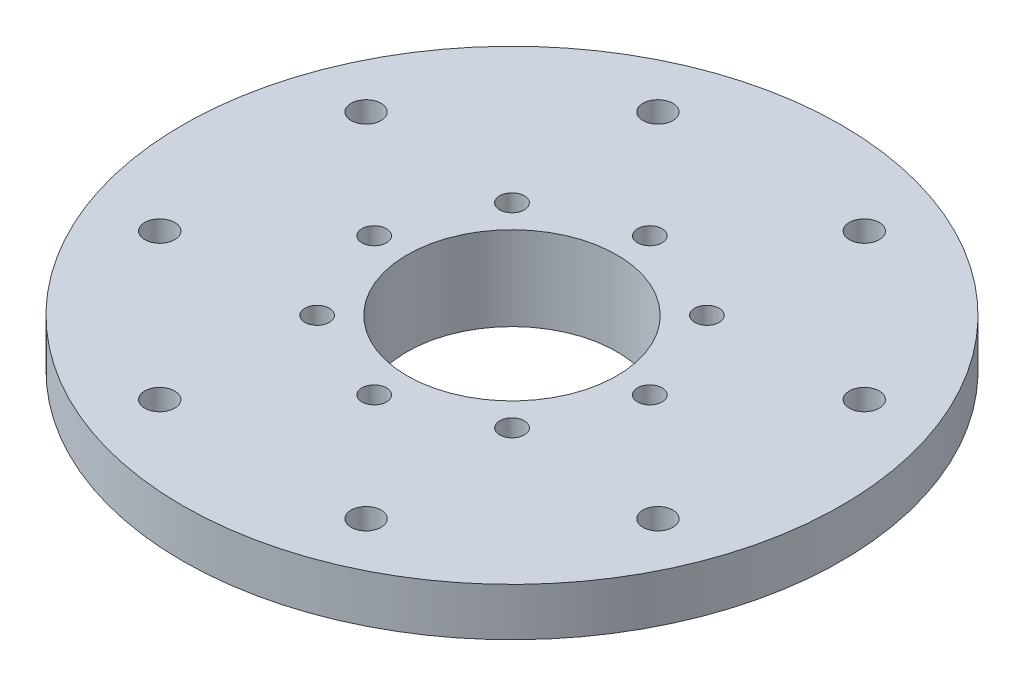
ISO-10303-21;
HEADER;
FILE_DESCRIPTION(('STEP AP214'),'2;1');
FILE_NAME('part.step','',(''),(''),'','','');
FILE_SCHEMA(('AUTOMOTIVE_DESIGN { 1 0 10303 214 1 1 1 1 }'));
ENDSEC;
DATA;
#1=APPLICATION_CONTEXT('core data for automotive mechanical design processes');
#2=APPLICATION_PROTOCOL_DEFINITION('international standard','automotive_design',2000,#1);
#3=PRODUCT_CONTEXT('',#1,'mechanical');
#4=PRODUCT('Part','Part','',(#3));
#5=PRODUCT_RELATED_PRODUCT_CATEGORY('part','',(#4));
#6=PRODUCT_DEFINITION_FORMATION('','',#4);
#7=PRODUCT_DEFINITION_CONTEXT('part definition',#1,'design');
#8=PRODUCT_DEFINITION('design','',#6,#7);
#9=PRODUCT_DEFINITION_SHAPE('','',#8);
#10=(LENGTH_UNIT() NAMED_UNIT(*) SI_UNIT(.MILLI.,.METRE.));
#11=(NAMED_UNIT(*) PLANE_ANGLE_UNIT() SI_UNIT($,.RADIAN.));
#12=(NAMED_UNIT(*) SI_UNIT($,.STERADIAN.) SOLID_ANGLE_UNIT());
#13=UNCERTAINTY_MEASURE_WITH_UNIT(LENGTH_MEASURE(1.E-05),#10,'distance_accuracy_value','');
#14=(GEOMETRIC_REPRESENTATION_CONTEXT(3) GLOBAL_UNCERTAINTY_ASSIGNED_CONTEXT((#13)) GLOBAL_UNIT_ASSIGNED_CONTEXT((#10,
#11,#12)) REPRESENTATION_CONTEXT('',''));
#15=CARTESIAN_POINT('',(0.,0.,0.));
#16=DIRECTION('',(0.,0.,1.));
#17=DIRECTION('',(1.,0.,0.));
#18=AXIS2_PLACEMENT_3D('',#15,#16,#17);
#19=CARTESIAN_POINT('',(0.,-6.,0.));
#20=DIRECTION('',(0.,-1.,0.));
#21=DIRECTION('',(0.,0.,-1.));
#22=AXIS2_PLACEMENT_3D('',#19,#20,#21);
#23=PLANE('',#22);
#24=CARTESIAN_POINT('',(-23.,-6.,-2.40912212380176E-13));
#25=DIRECTION('',(0.,1.,0.));
#26=DIRECTION('',(0.,0.,1.));
#27=AXIS2_PLACEMENT_3D('',#24,#25,#26);
#28=CIRCLE('',#27,2.05);
#29=CARTESIAN_POINT('',(-23.,-6.,2.04999999999976));
#30=VERTEX_POINT('',#29);
#31=EDGE_CURVE('E285',#30,#30,#28,.T.);
#32=ORIENTED_EDGE('',*,*,#31,.T.);
#33=EDGE_LOOP('',(#32));
#34=FACE_BOUND('',#33,.T.);
#35=CARTESIAN_POINT('',(-16.2634559672907,-6.,16.2634559672905));
#36=DIRECTION('',(0.,1.,0.));
#37=DIRECTION('',(0.,0.,1.));
#38=AXIS2_PLACEMENT_3D('',#35,#36,#37);
#39=CIRCLE('',#38,2.05);
#40=CARTESIAN_POINT('',(-16.2634559672907,-6.,18.3134559672904));
#41=VERTEX_POINT('',#40);
#42=EDGE_CURVE('E286',#41,#41,#39,.T.);
#43=ORIENTED_EDGE('',*,*,#42,.T.);
#44=EDGE_LOOP('',(#43));
#45=FACE_BOUND('',#44,.T.);
#46=CARTESIAN_POINT('',(16.2634559672905,-6.,16.2634559672907));
#47=DIRECTION('',(0.,1.,0.));
#48=DIRECTION('',(0.,0.,1.));
#49=AXIS2_PLACEMENT_3D('',#46,#47,#48);
#50=CIRCLE('',#49,2.05);
#51=CARTESIAN_POINT('',(16.2634559672905,-6.,18.3134559672907));
#52=VERTEX_POINT('',#51);
#53=EDGE_CURVE('E306',#52,#52,#50,.T.);
#54=ORIENTED_EDGE('',*,*,#53,.T.);
#55=EDGE_LOOP('',(#54));
#56=FACE_BOUND('',#55,.T.);
#57=CARTESIAN_POINT('',(23.,-6.,0.));
#58=DIRECTION('',(0.,1.,0.));
#59=DIRECTION('',(0.,0.,1.));
#60=AXIS2_PLACEMENT_3D('',#57,#58,#59);
#61=CIRCLE('',#60,2.05);
#62=CARTESIAN_POINT('',(23.,-6.,2.05000000000008));
#63=VERTEX_POINT('',#62);
#64=EDGE_CURVE('E313',#63,#63,#61,.T.);
#65=ORIENTED_EDGE('',*,*,#64,.T.);
#66=EDGE_LOOP('',(#65));
#67=FACE_BOUND('',#66,.T.);
#68=CARTESIAN_POINT('',(16.2634559672906,-6.,-16.2634559672906));
#69=DIRECTION('',(0.,1.,0.));
#70=DIRECTION('',(0.,0.,1.));
#71=AXIS2_PLACEMENT_3D('',#68,#69,#70);
#72=CIRCLE('',#71,2.05);
#73=CARTESIAN_POINT('',(16.2634559672906,-6.,-14.2134559672906));
#74=VERTEX_POINT('',#73);
#75=EDGE_CURVE('E324',#74,#74,#72,.T.);
#76=ORIENTED_EDGE('',*,*,#75,.T.);
#77=EDGE_LOOP('',(#76));
#78=FACE_BOUND('',#77,.T.);
#79=CARTESIAN_POINT('',(0.,-6.,-23.));
#80=DIRECTION('',(0.,1.,0.));
#81=DIRECTION('',(0.,0.,1.));
#82=AXIS2_PLACEMENT_3D('',#79,#80,#81);
#83=CIRCLE('',#82,2.05);
#84=CARTESIAN_POINT('',(0.,-6.,-20.95));
#85=VERTEX_POINT('',#84);
#86=EDGE_CURVE('E329',#85,#85,#83,.T.);
#87=ORIENTED_EDGE('',*,*,#86,.T.);
#88=EDGE_LOOP('',(#87));
#89=FACE_BOUND('',#88,.T.);
#90=CARTESIAN_POINT('',(0.,-6.,0.));
#91=DIRECTION('',(0.,1.,0.));
#92=DIRECTION('',(0.,0.,1.));
#93=AXIS2_PLACEMENT_3D('',#90,#91,#92);
#94=CIRCLE('',#93,17.5);
#95=CARTESIAN_POINT('',(0.,-6.,17.5));
#96=VERTEX_POINT('',#95);
#97=EDGE_CURVE('E331',#96,#96,#94,.T.);
#98=ORIENTED_EDGE('',*,*,#97,.T.);
#99=EDGE_LOOP('',(#98));
#100=FACE_BOUND('',#99,.T.);
#101=CARTESIAN_POINT('',(0.,-6.,0.));
#102=DIRECTION('',(0.,-1.,0.));
#103=DIRECTION('',(0.,0.,-1.));
#104=AXIS2_PLACEMENT_3D('',#101,#102,#103);
#105=CIRCLE('',#104,27.);
#106=CARTESIAN_POINT('',(0.,-6.,-27.));
#107=VERTEX_POINT('',#106);
#108=EDGE_CURVE('E198',#107,#107,#105,.T.);
#109=ORIENTED_EDGE('',*,*,#108,.T.);
#110=EDGE_LOOP('',(#109));
#111=FACE_BOUND('',#110,.T.);
#112=CARTESIAN_POINT('',(0.,-6.,23.));
#113=DIRECTION('',(0.,1.,0.));
#114=DIRECTION('',(0.,0.,1.));
#115=AXIS2_PLACEMENT_3D('',#112,#113,#114);
#116=CIRCLE('',#115,2.05);
#117=CARTESIAN_POINT('',(0.,-6.,25.05));
#118=VERTEX_POINT('',#117);
#119=EDGE_CURVE('E296',#118,#118,#116,.T.);
#120=ORIENTED_EDGE('',*,*,#119,.T.);
#121=EDGE_LOOP('',(#120));
#122=FACE_BOUND('',#121,.T.);
#123=CARTESIAN_POINT('',(-16.2634559672904,-6.,-16.2634559672908));
#124=DIRECTION('',(0.,1.,0.));
#125=DIRECTION('',(0.,0.,1.));
#126=AXIS2_PLACEMENT_3D('',#123,#124,#125);
#127=CIRCLE('',#126,2.05);
#128=CARTESIAN_POINT('',(-16.2634559672904,-6.,-14.2134559672908));
#129=VERTEX_POINT('',#128);
#130=EDGE_CURVE('E274',#129,#129,#127,.T.);
#131=ORIENTED_EDGE('',*,*,#130,.T.);
#132=EDGE_LOOP('',(#131));
#133=FACE_BOUND('',#132,.T.);
#134=ADVANCED_FACE('F179',(#34,#45,#56,#67,#78,#89,#100,#111,#122,#133),#23,.T.);
#135=CARTESIAN_POINT('',(0.,8.,0.));
#136=DIRECTION('',(0.,-1.,0.));
#137=DIRECTION('',(0.,0.,-1.));
#138=AXIS2_PLACEMENT_3D('',#135,#136,#137);
#139=CYLINDRICAL_SURFACE('',#138,55.);
#140=CARTESIAN_POINT('',(0.,8.,0.));
#141=DIRECTION('',(0.,1.,0.));
#142=DIRECTION('',(0.,0.,1.));
#143=AXIS2_PLACEMENT_3D('',#140,#141,#142);
#144=CIRCLE('',#143,55.);
#145=CARTESIAN_POINT('',(0.,8.,55.));
#146=VERTEX_POINT('',#145);
#147=EDGE_CURVE('E186',#146,#146,#144,.T.);
#148=ORIENTED_EDGE('',*,*,#147,.F.);
#149=EDGE_LOOP('',(#148));
#150=FACE_BOUND('',#149,.T.);
#151=CARTESIAN_POINT('',(0.,0.,0.));
#152=DIRECTION('',(0.,1.,0.));
#153=DIRECTION('',(0.,0.,1.));
#154=AXIS2_PLACEMENT_3D('',#151,#152,#153);
#155=CIRCLE('',#154,55.);
#156=CARTESIAN_POINT('',(0.,0.,55.));
#157=VERTEX_POINT('',#156);
#158=EDGE_CURVE('E196',#157,#157,#155,.T.);
#159=ORIENTED_EDGE('',*,*,#158,.T.);
#160=EDGE_LOOP('',(#159));
#161=FACE_BOUND('',#160,.T.);
#162=ADVANCED_FACE('F185',(#150,#161),#139,.T.);
#163=CARTESIAN_POINT('',(0.,8.,0.));
#164=DIRECTION('',(0.,1.,0.));
#165=DIRECTION('',(0.,0.,1.));
#166=AXIS2_PLACEMENT_3D('',#163,#164,#165);
#167=PLANE('',#166);
#168=CARTESIAN_POINT('',(41.5745789630077,8.,-17.2207544564295));
#169=DIRECTION('',(0.,1.,0.));
#170=DIRECTION('',(0.,0.,1.));
#171=AXIS2_PLACEMENT_3D('',#168,#169,#170);
#172=CIRCLE('',#171,2.5);
#173=CARTESIAN_POINT('',(41.5745789630077,8.,-14.7207544564295));
#174=VERTEX_POINT('',#173);
#175=EDGE_CURVE('E243',#174,#174,#172,.T.);
#176=ORIENTED_EDGE('',*,*,#175,.F.);
#177=EDGE_LOOP('',(#176));
#178=FACE_BOUND('',#177,.T.);
#179=CARTESIAN_POINT('',(41.5745789630081,8.,17.2207544564286));
#180=DIRECTION('',(0.,1.,0.));
#181=DIRECTION('',(0.,0.,1.));
#182=AXIS2_PLACEMENT_3D('',#179,#180,#181);
#183=CIRCLE('',#182,2.5);
#184=CARTESIAN_POINT('',(41.5745789630081,8.,19.7207544564286));
#185=VERTEX_POINT('',#184);
#186=EDGE_CURVE('E226',#185,#185,#183,.T.);
#187=ORIENTED_EDGE('',*,*,#186,.F.);
#188=EDGE_LOOP('',(#187));
#189=FACE_BOUND('',#188,.T.);
#190=CARTESIAN_POINT('',(17.2207544564294,8.,41.5745789630078));
#191=DIRECTION('',(0.,1.,0.));
#192=DIRECTION('',(0.,0.,1.));
#193=AXIS2_PLACEMENT_3D('',#190,#191,#192);
#194=CIRCLE('',#193,2.5);
#195=CARTESIAN_POINT('',(17.2207544564294,8.,44.0745789630078));
#196=VERTEX_POINT('',#195);
#197=EDGE_CURVE('E225',#196,#196,#194,.T.);
#198=ORIENTED_EDGE('',*,*,#197,.F.);
#199=EDGE_LOOP('',(#198));
#200=FACE_BOUND('',#199,.T.);
#201=CARTESIAN_POINT('',(-17.2207544564291,8.,41.5745789630079));
#202=DIRECTION('',(0.,1.,0.));
#203=DIRECTION('',(0.,0.,1.));
#204=AXIS2_PLACEMENT_3D('',#201,#202,#203);
#205=CIRCLE('',#204,2.5);
#206=CARTESIAN_POINT('',(-17.2207544564291,8.,44.0745789630079));
#207=VERTEX_POINT('',#206);
#208=EDGE_CURVE('E219',#207,#207,#205,.T.);
#209=ORIENTED_EDGE('',*,*,#208,.F.);
#210=EDGE_LOOP('',(#209));
#211=FACE_BOUND('',#210,.T.);
#212=CARTESIAN_POINT('',(-41.5745789630078,8.,17.2207544564292));
#213=DIRECTION('',(0.,1.,0.));
#214=DIRECTION('',(0.,0.,1.));
#215=AXIS2_PLACEMENT_3D('',#212,#213,#214);
#216=CIRCLE('',#215,2.5);
#217=CARTESIAN_POINT('',(-41.5745789630078,8.,19.7207544564292));
#218=VERTEX_POINT('',#217);
#219=EDGE_CURVE('E211',#218,#218,#216,.T.);
#220=ORIENTED_EDGE('',*,*,#219,.F.);
#221=EDGE_LOOP('',(#220));
#222=FACE_BOUND('',#221,.T.);
#223=CARTESIAN_POINT('',(-41.574578963008,8.,-17.2207544564289));
#224=DIRECTION('',(0.,1.,0.));
#225=DIRECTION('',(0.,0.,1.));
#226=AXIS2_PLACEMENT_3D('',#223,#224,#225);
#227=CIRCLE('',#226,2.5);
#228=CARTESIAN_POINT('',(-41.574578963008,8.,-14.7207544564289));
#229=VERTEX_POINT('',#228);
#230=EDGE_CURVE('E208',#229,#229,#227,.T.);
#231=ORIENTED_EDGE('',*,*,#230,.F.);
#232=EDGE_LOOP('',(#231));
#233=FACE_BOUND('',#232,.T.);
#234=CARTESIAN_POINT('',(-17.2207544564291,8.,-41.5745789630079));
#235=DIRECTION('',(0.,1.,0.));
#236=DIRECTION('',(0.,0.,1.));
#237=AXIS2_PLACEMENT_3D('',#234,#235,#236);
#238=CIRCLE('',#237,2.5);
#239=CARTESIAN_POINT('',(-17.2207544564291,8.,-39.0745789630079));
#240=VERTEX_POINT('',#239);
#241=EDGE_CURVE('E209',#240,#240,#238,.T.);
#242=ORIENTED_EDGE('',*,*,#241,.F.);
#243=EDGE_LOOP('',(#242));
#244=FACE_BOUND('',#243,.T.);
#245=CARTESIAN_POINT('',(17.2207544564291,8.,-41.5745789630079));
#246=DIRECTION('',(0.,1.,0.));
#247=DIRECTION('',(0.,0.,1.));
#248=AXIS2_PLACEMENT_3D('',#245,#246,#247);
#249=CIRCLE('',#248,2.5);
#250=CARTESIAN_POINT('',(17.2207544564291,8.,-39.0745789630079));
#251=VERTEX_POINT('',#250);
#252=EDGE_CURVE('E265',#251,#251,#249,.T.);
#253=ORIENTED_EDGE('',*,*,#252,.F.);
#254=EDGE_LOOP('',(#253));
#255=FACE_BOUND('',#254,.T.);
#256=CARTESIAN_POINT('',(-16.2634559672904,8.,-16.2634559672908));
#257=DIRECTION('',(0.,1.,0.));
#258=DIRECTION('',(0.,0.,1.));
#259=AXIS2_PLACEMENT_3D('',#256,#257,#258);
#260=CIRCLE('',#259,2.05);
#261=CARTESIAN_POINT('',(-16.2634559672904,8.,-14.2134559672908));
#262=VERTEX_POINT('',#261);
#263=EDGE_CURVE('E266',#262,#262,#260,.T.);
#264=ORIENTED_EDGE('',*,*,#263,.F.);
#265=EDGE_LOOP('',(#264));
#266=FACE_BOUND('',#265,.T.);
#267=CARTESIAN_POINT('',(-23.,8.,-2.40912212380176E-13));
#268=DIRECTION('',(0.,1.,0.));
#269=DIRECTION('',(0.,0.,1.));
#270=AXIS2_PLACEMENT_3D('',#267,#268,#269);
#271=CIRCLE('',#270,2.05);
#272=CARTESIAN_POINT('',(-23.,8.,2.04999999999976));
#273=VERTEX_POINT('',#272);
#274=EDGE_CURVE('E277',#273,#273,#271,.T.);
#275=ORIENTED_EDGE('',*,*,#274,.F.);
#276=EDGE_LOOP('',(#275));
#277=FACE_BOUND('',#276,.T.);
#278=CARTESIAN_POINT('',(-16.2634559672907,8.,16.2634559672905));
#279=DIRECTION('',(0.,1.,0.));
#280=DIRECTION('',(0.,0.,1.));
#281=AXIS2_PLACEMENT_3D('',#278,#279,#280);
#282=CIRCLE('',#281,2.05);
#283=CARTESIAN_POINT('',(-16.2634559672907,8.,18.3134559672904));
#284=VERTEX_POINT('',#283);
#285=EDGE_CURVE('E288',#284,#284,#282,.T.);
#286=ORIENTED_EDGE('',*,*,#285,.F.);
#287=EDGE_LOOP('',(#286));
#288=FACE_BOUND('',#287,.T.);
#289=CARTESIAN_POINT('',(0.,8.,23.));
#290=DIRECTION('',(0.,1.,0.));
#291=DIRECTION('',(0.,0.,1.));
#292=AXIS2_PLACEMENT_3D('',#289,#290,#291);
#293=CIRCLE('',#292,2.05);
#294=CARTESIAN_POINT('',(0.,8.,25.05));
#295=VERTEX_POINT('',#294);
#296=EDGE_CURVE('E295',#295,#295,#293,.T.);
#297=ORIENTED_EDGE('',*,*,#296,.F.);
#298=EDGE_LOOP('',(#297));
#299=FACE_BOUND('',#298,.T.);
#300=CARTESIAN_POINT('',(16.2634559672905,8.,16.2634559672907));
#301=DIRECTION('',(0.,1.,0.));
#302=DIRECTION('',(0.,0.,1.));
#303=AXIS2_PLACEMENT_3D('',#300,#301,#302);
#304=CIRCLE('',#303,2.05);
#305=CARTESIAN_POINT('',(16.2634559672905,8.,18.3134559672907));
#306=VERTEX_POINT('',#305);
#307=EDGE_CURVE('E305',#306,#306,#304,.T.);
#308=ORIENTED_EDGE('',*,*,#307,.F.);
#309=EDGE_LOOP('',(#308));
#310=FACE_BOUND('',#309,.T.);
#311=CARTESIAN_POINT('',(23.,8.,0.));
#312=DIRECTION('',(0.,1.,0.));
#313=DIRECTION('',(0.,0.,1.));
#314=AXIS2_PLACEMENT_3D('',#311,#312,#313);
#315=CIRCLE('',#314,2.05);
#316=CARTESIAN_POINT('',(23.,8.,2.05000000000008));
#317=VERTEX_POINT('',#316);
#318=EDGE_CURVE('E309',#317,#317,#315,.T.);
#319=ORIENTED_EDGE('',*,*,#318,.F.);
#320=EDGE_LOOP('',(#319));
#321=FACE_BOUND('',#320,.T.);
#322=CARTESIAN_POINT('',(16.2634559672906,8.,-16.2634559672906));
#323=DIRECTION('',(0.,1.,0.));
#324=DIRECTION('',(0.,0.,1.));
#325=AXIS2_PLACEMENT_3D('',#322,#323,#324);
#326=CIRCLE('',#325,2.05);
#327=CARTESIAN_POINT('',(16.2634559672906,8.,-14.2134559672906));
#328=VERTEX_POINT('',#327);
#329=EDGE_CURVE('E319',#328,#328,#326,.T.);
#330=ORIENTED_EDGE('',*,*,#329,.F.);
#331=EDGE_LOOP('',(#330));
#332=FACE_BOUND('',#331,.T.);
#333=CARTESIAN_POINT('',(0.,8.,-23.));
#334=DIRECTION('',(0.,1.,0.));
#335=DIRECTION('',(0.,0.,1.));
#336=AXIS2_PLACEMENT_3D('',#333,#334,#335);
#337=CIRCLE('',#336,2.05);
#338=CARTESIAN_POINT('',(0.,8.,-20.95));
#339=VERTEX_POINT('',#338);
#340=EDGE_CURVE('E326',#339,#339,#337,.T.);
#341=ORIENTED_EDGE('',*,*,#340,.F.);
#342=EDGE_LOOP('',(#341));
#343=FACE_BOUND('',#342,.T.);
#344=CARTESIAN_POINT('',(0.,8.,0.));
#345=DIRECTION('',(0.,1.,0.));
#346=DIRECTION('',(0.,0.,1.));
#347=AXIS2_PLACEMENT_3D('',#344,#345,#346);
#348=CIRCLE('',#347,17.5);
#349=CARTESIAN_POINT('',(0.,8.,17.5));
#350=VERTEX_POINT('',#349);
#351=EDGE_CURVE('E335',#350,#350,#348,.T.);
#352=ORIENTED_EDGE('',*,*,#351,.F.);
#353=EDGE_LOOP('',(#352));
#354=FACE_BOUND('',#353,.T.);
#355=ORIENTED_EDGE('',*,*,#147,.T.);
#356=EDGE_LOOP('',(#355));
#357=FACE_BOUND('',#356,.T.);
#358=ADVANCED_FACE('F341',(#178,#189,#200,#211,#222,#233,#244,#255,#266,#277,#288,#299,#310,
#321,#332,#343,#354,#357),#167,.T.);
#359=CARTESIAN_POINT('',(0.,0.,0.));
#360=DIRECTION('',(0.,1.,0.));
#361=DIRECTION('',(0.,0.,1.));
#362=AXIS2_PLACEMENT_3D('',#359,#360,#361);
#363=PLANE('',#362);
#364=CARTESIAN_POINT('',(41.5745789630077,0.,-17.2207544564295));
#365=DIRECTION('',(0.,1.,0.));
#366=DIRECTION('',(0.,0.,1.));
#367=AXIS2_PLACEMENT_3D('',#364,#365,#366);
#368=CIRCLE('',#367,2.5);
#369=CARTESIAN_POINT('',(41.5745789630077,0.,-14.7207544564295));
#370=VERTEX_POINT('',#369);
#371=EDGE_CURVE('E183',#370,#370,#368,.T.);
#372=ORIENTED_EDGE('',*,*,#371,.T.);
#373=EDGE_LOOP('',(#372));
#374=FACE_BOUND('',#373,.T.);
#375=CARTESIAN_POINT('',(41.5745789630081,0.,17.2207544564286));
#376=DIRECTION('',(0.,1.,0.));
#377=DIRECTION('',(0.,0.,1.));
#378=AXIS2_PLACEMENT_3D('',#375,#376,#377);
#379=CIRCLE('',#378,2.5);
#380=CARTESIAN_POINT('',(41.5745789630081,0.,19.7207544564286));
#381=VERTEX_POINT('',#380);
#382=EDGE_CURVE('E221',#381,#381,#379,.T.);
#383=ORIENTED_EDGE('',*,*,#382,.T.);
#384=EDGE_LOOP('',(#383));
#385=FACE_BOUND('',#384,.T.);
#386=CARTESIAN_POINT('',(17.2207544564294,0.,41.5745789630078));
#387=DIRECTION('',(0.,1.,0.));
#388=DIRECTION('',(0.,0.,1.));
#389=AXIS2_PLACEMENT_3D('',#386,#387,#388);
#390=CIRCLE('',#389,2.5);
#391=CARTESIAN_POINT('',(17.2207544564294,0.,44.0745789630078));
#392=VERTEX_POINT('',#391);
#393=EDGE_CURVE('E223',#392,#392,#390,.T.);
#394=ORIENTED_EDGE('',*,*,#393,.T.);
#395=EDGE_LOOP('',(#394));
#396=FACE_BOUND('',#395,.T.);
#397=CARTESIAN_POINT('',(-17.2207544564291,0.,41.5745789630079));
#398=DIRECTION('',(0.,1.,0.));
#399=DIRECTION('',(0.,0.,1.));
#400=AXIS2_PLACEMENT_3D('',#397,#398,#399);
#401=CIRCLE('',#400,2.5);
#402=CARTESIAN_POINT('',(-17.2207544564291,0.,44.0745789630079));
#403=VERTEX_POINT('',#402);
#404=EDGE_CURVE('E216',#403,#403,#401,.T.);
#405=ORIENTED_EDGE('',*,*,#404,.T.);
#406=EDGE_LOOP('',(#405));
#407=FACE_BOUND('',#406,.T.);
#408=CARTESIAN_POINT('',(-41.5745789630078,0.,17.2207544564292));
#409=DIRECTION('',(0.,1.,0.));
#410=DIRECTION('',(0.,0.,1.));
#411=AXIS2_PLACEMENT_3D('',#408,#409,#410);
#412=CIRCLE('',#411,2.5);
#413=CARTESIAN_POINT('',(-41.5745789630078,0.,19.7207544564292));
#414=VERTEX_POINT('',#413);
#415=EDGE_CURVE('E213',#414,#414,#412,.T.);
#416=ORIENTED_EDGE('',*,*,#415,.T.);
#417=EDGE_LOOP('',(#416));
#418=FACE_BOUND('',#417,.T.);
#419=CARTESIAN_POINT('',(-41.574578963008,0.,-17.2207544564289));
#420=DIRECTION('',(0.,1.,0.));
#421=DIRECTION('',(0.,0.,1.));
#422=AXIS2_PLACEMENT_3D('',#419,#420,#421);
#423=CIRCLE('',#422,2.5);
#424=CARTESIAN_POINT('',(-41.574578963008,0.,-14.7207544564289));
#425=VERTEX_POINT('',#424);
#426=EDGE_CURVE('E201',#425,#425,#423,.T.);
#427=ORIENTED_EDGE('',*,*,#426,.T.);
#428=EDGE_LOOP('',(#427));
#429=FACE_BOUND('',#428,.T.);
#430=CARTESIAN_POINT('',(-17.2207544564291,0.,-41.5745789630079));
#431=DIRECTION('',(0.,1.,0.));
#432=DIRECTION('',(0.,0.,1.));
#433=AXIS2_PLACEMENT_3D('',#430,#431,#432);
#434=CIRCLE('',#433,2.5);
#435=CARTESIAN_POINT('',(-17.2207544564291,0.,-39.0745789630079));
#436=VERTEX_POINT('',#435);
#437=EDGE_CURVE('E257',#436,#436,#434,.T.);
#438=ORIENTED_EDGE('',*,*,#437,.T.);
#439=EDGE_LOOP('',(#438));
#440=FACE_BOUND('',#439,.T.);
#441=CARTESIAN_POINT('',(17.2207544564291,0.,-41.5745789630079));
#442=DIRECTION('',(0.,1.,0.));
#443=DIRECTION('',(0.,0.,1.));
#444=AXIS2_PLACEMENT_3D('',#441,#442,#443);
#445=CIRCLE('',#444,2.5);
#446=CARTESIAN_POINT('',(17.2207544564291,0.,-39.0745789630079));
#447=VERTEX_POINT('',#446);
#448=EDGE_CURVE('E268',#447,#447,#445,.T.);
#449=ORIENTED_EDGE('',*,*,#448,.T.);
#450=EDGE_LOOP('',(#449));
#451=FACE_BOUND('',#450,.T.);
#452=CARTESIAN_POINT('',(0.,0.,0.));
#453=DIRECTION('',(0.,-1.,0.));
#454=DIRECTION('',(0.,0.,-1.));
#455=AXIS2_PLACEMENT_3D('',#452,#453,#454);
#456=CIRCLE('',#455,27.);
#457=CARTESIAN_POINT('',(0.,0.,-27.));
#458=VERTEX_POINT('',#457);
#459=EDGE_CURVE('E11',#458,#458,#456,.T.);
#460=ORIENTED_EDGE('',*,*,#459,.F.);
#461=EDGE_LOOP('',(#460));
#462=FACE_BOUND('',#461,.T.);
#463=ORIENTED_EDGE('',*,*,#158,.F.);
#464=EDGE_LOOP('',(#463));
#465=FACE_BOUND('',#464,.T.);
#466=ADVANCED_FACE('F347',(#374,#385,#396,#407,#418,#429,#440,#451,#462,#465),#363,.F.);
#467=CARTESIAN_POINT('',(0.,-6.,0.));
#468=DIRECTION('',(0.,1.,0.));
#469=DIRECTION('',(0.,0.,1.));
#470=AXIS2_PLACEMENT_3D('',#467,#468,#469);
#471=CYLINDRICAL_SURFACE('',#470,27.);
#472=ORIENTED_EDGE('',*,*,#108,.F.);
#473=EDGE_LOOP('',(#472));
#474=FACE_BOUND('',#473,.T.);
#475=ORIENTED_EDGE('',*,*,#459,.T.);
#476=EDGE_LOOP('',(#475));
#477=FACE_BOUND('',#476,.T.);
#478=ADVANCED_FACE('F356',(#474,#477),#471,.T.);
#479=CARTESIAN_POINT('',(0.,-6.,0.));
#480=DIRECTION('',(0.,1.,0.));
#481=DIRECTION('',(0.,0.,1.));
#482=AXIS2_PLACEMENT_3D('',#479,#480,#481);
#483=CYLINDRICAL_SURFACE('',#482,17.5);
#484=ORIENTED_EDGE('',*,*,#97,.F.);
#485=EDGE_LOOP('',(#484));
#486=FACE_BOUND('',#485,.T.);
#487=ORIENTED_EDGE('',*,*,#351,.T.);
#488=EDGE_LOOP('',(#487));
#489=FACE_BOUND('',#488,.T.);
#490=ADVANCED_FACE('F342',(#486,#489),#483,.F.);
#491=CARTESIAN_POINT('',(0.,8.,-23.));
#492=DIRECTION('',(0.,1.,0.));
#493=DIRECTION('',(0.,0.,1.));
#494=AXIS2_PLACEMENT_3D('',#491,#492,#493);
#495=CYLINDRICAL_SURFACE('',#494,2.05);
#496=ORIENTED_EDGE('',*,*,#86,.F.);
#497=EDGE_LOOP('',(#496));
#498=FACE_BOUND('',#497,.T.);
#499=ORIENTED_EDGE('',*,*,#340,.T.);
#500=EDGE_LOOP('',(#499));
#501=FACE_BOUND('',#500,.T.);
#502=ADVANCED_FACE('F380',(#498,#501),#495,.F.);
#503=CARTESIAN_POINT('',(16.2634559672906,8.,-16.2634559672906));
#504=DIRECTION('',(0.,1.,0.));
#505=DIRECTION('',(0.,0.,1.));
#506=AXIS2_PLACEMENT_3D('',#503,#504,#505);
#507=CYLINDRICAL_SURFACE('',#506,2.05);
#508=ORIENTED_EDGE('',*,*,#75,.F.);
#509=EDGE_LOOP('',(#508));
#510=FACE_BOUND('',#509,.T.);
#511=ORIENTED_EDGE('',*,*,#329,.T.);
#512=EDGE_LOOP('',(#511));
#513=FACE_BOUND('',#512,.T.);
#514=ADVANCED_FACE('F379',(#510,#513),#507,.F.);
#515=CARTESIAN_POINT('',(23.,8.,0.));
#516=DIRECTION('',(0.,1.,0.));
#517=DIRECTION('',(0.,0.,1.));
#518=AXIS2_PLACEMENT_3D('',#515,#516,#517);
#519=CYLINDRICAL_SURFACE('',#518,2.05);
#520=ORIENTED_EDGE('',*,*,#64,.F.);
#521=EDGE_LOOP('',(#520));
#522=FACE_BOUND('',#521,.T.);
#523=ORIENTED_EDGE('',*,*,#318,.T.);
#524=EDGE_LOOP('',(#523));
#525=FACE_BOUND('',#524,.T.);
#526=ADVANCED_FACE('F384',(#522,#525),#519,.F.);
#527=CARTESIAN_POINT('',(16.2634559672905,8.,16.2634559672907));
#528=DIRECTION('',(0.,1.,0.));
#529=DIRECTION('',(0.,0.,1.));
#530=AXIS2_PLACEMENT_3D('',#527,#528,#529);
#531=CYLINDRICAL_SURFACE('',#530,2.05);
#532=ORIENTED_EDGE('',*,*,#53,.F.);
#533=EDGE_LOOP('',(#532));
#534=FACE_BOUND('',#533,.T.);
#535=ORIENTED_EDGE('',*,*,#307,.T.);
#536=EDGE_LOOP('',(#535));
#537=FACE_BOUND('',#536,.T.);
#538=ADVANCED_FACE('F389',(#534,#537),#531,.F.);
#539=CARTESIAN_POINT('',(0.,8.,23.));
#540=DIRECTION('',(0.,1.,0.));
#541=DIRECTION('',(0.,0.,1.));
#542=AXIS2_PLACEMENT_3D('',#539,#540,#541);
#543=CYLINDRICAL_SURFACE('',#542,2.05);
#544=ORIENTED_EDGE('',*,*,#119,.F.);
#545=EDGE_LOOP('',(#544));
#546=FACE_BOUND('',#545,.T.);
#547=ORIENTED_EDGE('',*,*,#296,.T.);
#548=EDGE_LOOP('',(#547));
#549=FACE_BOUND('',#548,.T.);
#550=ADVANCED_FACE('F391',(#546,#549),#543,.F.);
#551=CARTESIAN_POINT('',(-16.2634559672907,8.,16.2634559672905));
#552=DIRECTION('',(0.,1.,0.));
#553=DIRECTION('',(0.,0.,1.));
#554=AXIS2_PLACEMENT_3D('',#551,#552,#553);
#555=CYLINDRICAL_SURFACE('',#554,2.05);
#556=ORIENTED_EDGE('',*,*,#42,.F.);
#557=EDGE_LOOP('',(#556));
#558=FACE_BOUND('',#557,.T.);
#559=ORIENTED_EDGE('',*,*,#285,.T.);
#560=EDGE_LOOP('',(#559));
#561=FACE_BOUND('',#560,.T.);
#562=ADVANCED_FACE('F394',(#558,#561),#555,.F.);
#563=CARTESIAN_POINT('',(-23.,8.,-2.40912212380176E-13));
#564=DIRECTION('',(0.,1.,0.));
#565=DIRECTION('',(0.,0.,1.));
#566=AXIS2_PLACEMENT_3D('',#563,#564,#565);
#567=CYLINDRICAL_SURFACE('',#566,2.05);
#568=ORIENTED_EDGE('',*,*,#31,.F.);
#569=EDGE_LOOP('',(#568));
#570=FACE_BOUND('',#569,.T.);
#571=ORIENTED_EDGE('',*,*,#274,.T.);
#572=EDGE_LOOP('',(#571));
#573=FACE_BOUND('',#572,.T.);
#574=ADVANCED_FACE('F400',(#570,#573),#567,.F.);
#575=CARTESIAN_POINT('',(-16.2634559672904,8.,-16.2634559672908));
#576=DIRECTION('',(0.,1.,0.));
#577=DIRECTION('',(0.,0.,1.));
#578=AXIS2_PLACEMENT_3D('',#575,#576,#577);
#579=CYLINDRICAL_SURFACE('',#578,2.05);
#580=ORIENTED_EDGE('',*,*,#130,.F.);
#581=EDGE_LOOP('',(#580));
#582=FACE_BOUND('',#581,.T.);
#583=ORIENTED_EDGE('',*,*,#263,.T.);
#584=EDGE_LOOP('',(#583));
#585=FACE_BOUND('',#584,.T.);
#586=ADVANCED_FACE('F401',(#582,#585),#579,.F.);
#587=CARTESIAN_POINT('',(17.2207544564291,8.,-41.5745789630079));
#588=DIRECTION('',(0.,1.,0.));
#589=DIRECTION('',(0.,0.,1.));
#590=AXIS2_PLACEMENT_3D('',#587,#588,#589);
#591=CYLINDRICAL_SURFACE('',#590,2.5);
#592=ORIENTED_EDGE('',*,*,#252,.T.);
#593=EDGE_LOOP('',(#592));
#594=FACE_BOUND('',#593,.T.);
#595=ORIENTED_EDGE('',*,*,#448,.F.);
#596=EDGE_LOOP('',(#595));
#597=FACE_BOUND('',#596,.T.);
#598=ADVANCED_FACE('F409',(#594,#597),#591,.F.);
#599=CARTESIAN_POINT('',(-17.2207544564291,8.,-41.5745789630079));
#600=DIRECTION('',(0.,1.,0.));
#601=DIRECTION('',(0.,0.,1.));
#602=AXIS2_PLACEMENT_3D('',#599,#600,#601);
#603=CYLINDRICAL_SURFACE('',#602,2.5);
#604=ORIENTED_EDGE('',*,*,#241,.T.);
#605=EDGE_LOOP('',(#604));
#606=FACE_BOUND('',#605,.T.);
#607=ORIENTED_EDGE('',*,*,#437,.F.);
#608=EDGE_LOOP('',(#607));
#609=FACE_BOUND('',#608,.T.);
#610=ADVANCED_FACE('F411',(#606,#609),#603,.F.);
#611=CARTESIAN_POINT('',(-41.574578963008,8.,-17.2207544564289));
#612=DIRECTION('',(0.,1.,0.));
#613=DIRECTION('',(0.,0.,1.));
#614=AXIS2_PLACEMENT_3D('',#611,#612,#613);
#615=CYLINDRICAL_SURFACE('',#614,2.5);
#616=ORIENTED_EDGE('',*,*,#230,.T.);
#617=EDGE_LOOP('',(#616));
#618=FACE_BOUND('',#617,.T.);
#619=ORIENTED_EDGE('',*,*,#426,.F.);
#620=EDGE_LOOP('',(#619));
#621=FACE_BOUND('',#620,.T.);
#622=ADVANCED_FACE('F413',(#618,#621),#615,.F.);
#623=CARTESIAN_POINT('',(-41.5745789630078,8.,17.2207544564292));
#624=DIRECTION('',(0.,1.,0.));
#625=DIRECTION('',(0.,0.,1.));
#626=AXIS2_PLACEMENT_3D('',#623,#624,#625);
#627=CYLINDRICAL_SURFACE('',#626,2.5);
#628=ORIENTED_EDGE('',*,*,#219,.T.);
#629=EDGE_LOOP('',(#628));
#630=FACE_BOUND('',#629,.T.);
#631=ORIENTED_EDGE('',*,*,#415,.F.);
#632=EDGE_LOOP('',(#631));
#633=FACE_BOUND('',#632,.T.);
#634=ADVANCED_FACE('F417',(#630,#633),#627,.F.);
#635=CARTESIAN_POINT('',(-17.2207544564291,8.,41.5745789630079));
#636=DIRECTION('',(0.,1.,0.));
#637=DIRECTION('',(0.,0.,1.));
#638=AXIS2_PLACEMENT_3D('',#635,#636,#637);
#639=CYLINDRICAL_SURFACE('',#638,2.5);
#640=ORIENTED_EDGE('',*,*,#208,.T.);
#641=EDGE_LOOP('',(#640));
#642=FACE_BOUND('',#641,.T.);
#643=ORIENTED_EDGE('',*,*,#404,.F.);
#644=EDGE_LOOP('',(#643));
#645=FACE_BOUND('',#644,.T.);
#646=ADVANCED_FACE('F422',(#642,#645),#639,.F.);
#647=CARTESIAN_POINT('',(17.2207544564294,8.,41.5745789630078));
#648=DIRECTION('',(0.,1.,0.));
#649=DIRECTION('',(0.,0.,1.));
#650=AXIS2_PLACEMENT_3D('',#647,#648,#649);
#651=CYLINDRICAL_SURFACE('',#650,2.5);
#652=ORIENTED_EDGE('',*,*,#197,.T.);
#653=EDGE_LOOP('',(#652));
#654=FACE_BOUND('',#653,.T.);
#655=ORIENTED_EDGE('',*,*,#393,.F.);
#656=EDGE_LOOP('',(#655));
#657=FACE_BOUND('',#656,.T.);
#658=ADVANCED_FACE('F428',(#654,#657),#651,.F.);
#659=CARTESIAN_POINT('',(41.5745789630081,8.,17.2207544564286));
#660=DIRECTION('',(0.,1.,0.));
#661=DIRECTION('',(0.,0.,1.));
#662=AXIS2_PLACEMENT_3D('',#659,#660,#661);
#663=CYLINDRICAL_SURFACE('',#662,2.5);
#664=ORIENTED_EDGE('',*,*,#186,.T.);
#665=EDGE_LOOP('',(#664));
#666=FACE_BOUND('',#665,.T.);
#667=ORIENTED_EDGE('',*,*,#382,.F.);
#668=EDGE_LOOP('',(#667));
#669=FACE_BOUND('',#668,.T.);
#670=ADVANCED_FACE('F427',(#666,#669),#663,.F.);
#671=CARTESIAN_POINT('',(41.5745789630077,8.,-17.2207544564295));
#672=DIRECTION('',(0.,1.,0.));
#673=DIRECTION('',(0.,0.,1.));
#674=AXIS2_PLACEMENT_3D('',#671,#672,#673);
#675=CYLINDRICAL_SURFACE('',#674,2.5);
#676=ORIENTED_EDGE('',*,*,#175,.T.);
#677=EDGE_LOOP('',(#676));
#678=FACE_BOUND('',#677,.T.);
#679=ORIENTED_EDGE('',*,*,#371,.F.);
#680=EDGE_LOOP('',(#679));
#681=FACE_BOUND('',#680,.T.);
#682=ADVANCED_FACE('F432',(#678,#681),#675,.F.);
#683=CLOSED_SHELL('',(#134,#162,#358,#466,#478,#490,#502,#514,#526,#538,#550,#562,#574,#586,
#598,#610,#622,#634,#646,#658,#670,#682));
#684=MANIFOLD_SOLID_BREP('B2',#683);
#685=ADVANCED_BREP_SHAPE_REPRESENTATION('',(#18,#684),#14);
#686=SHAPE_DEFINITION_REPRESENTATION(#9,#685);
ENDSEC;
END-ISO-10303-21;
